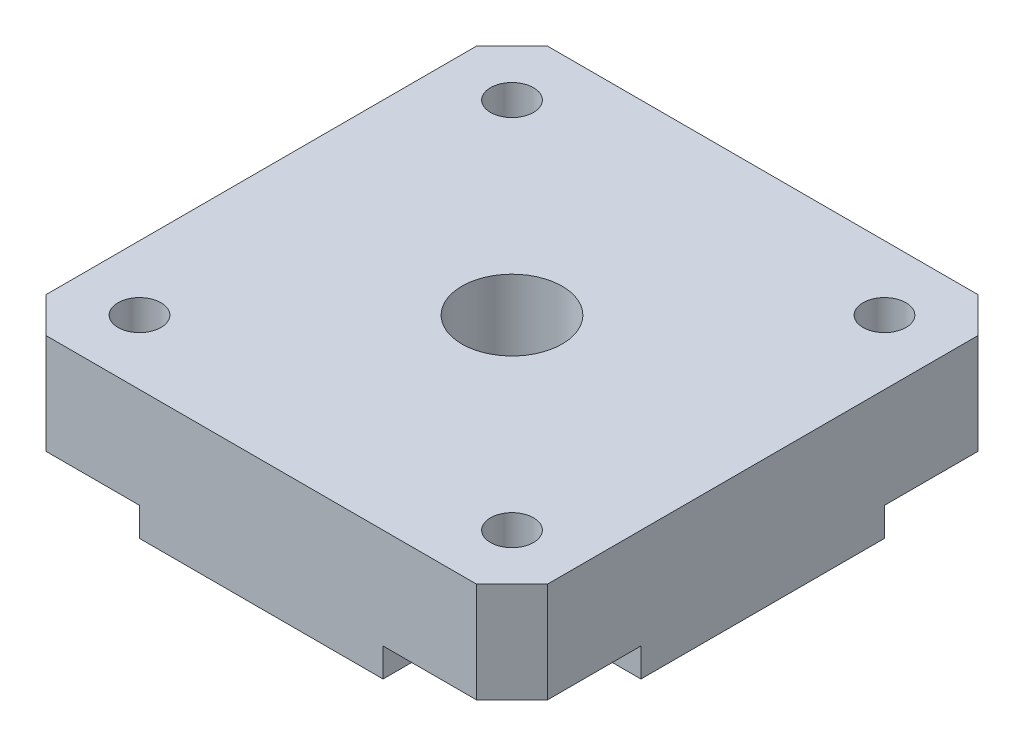
ISO-10303-21;
HEADER;
FILE_DESCRIPTION(('STEP AP214'),'2;1');
FILE_NAME('part.step','',(''),(''),'','','');
FILE_SCHEMA(('AUTOMOTIVE_DESIGN { 1 0 10303 214 1 1 1 1 }'));
ENDSEC;
DATA;
#1=APPLICATION_CONTEXT('core data for automotive mechanical design processes');
#2=APPLICATION_PROTOCOL_DEFINITION('international standard','automotive_design',2000,#1);
#3=PRODUCT_CONTEXT('',#1,'mechanical');
#4=PRODUCT('Part','Part','',(#3));
#5=PRODUCT_RELATED_PRODUCT_CATEGORY('part','',(#4));
#6=PRODUCT_DEFINITION_FORMATION('','',#4);
#7=PRODUCT_DEFINITION_CONTEXT('part definition',#1,'design');
#8=PRODUCT_DEFINITION('design','',#6,#7);
#9=PRODUCT_DEFINITION_SHAPE('','',#8);
#10=(LENGTH_UNIT() NAMED_UNIT(*) SI_UNIT(.MILLI.,.METRE.));
#11=(NAMED_UNIT(*) PLANE_ANGLE_UNIT() SI_UNIT($,.RADIAN.));
#12=(NAMED_UNIT(*) SI_UNIT($,.STERADIAN.) SOLID_ANGLE_UNIT());
#13=UNCERTAINTY_MEASURE_WITH_UNIT(LENGTH_MEASURE(1.E-05),#10,'distance_accuracy_value','');
#14=(GEOMETRIC_REPRESENTATION_CONTEXT(3) GLOBAL_UNCERTAINTY_ASSIGNED_CONTEXT((#13)) GLOBAL_UNIT_ASSIGNED_CONTEXT((#10,
#11,#12)) REPRESENTATION_CONTEXT('',''));
#15=CARTESIAN_POINT('',(0.,0.,0.));
#16=DIRECTION('',(0.,0.,1.));
#17=DIRECTION('',(1.,0.,0.));
#18=AXIS2_PLACEMENT_3D('',#15,#16,#17);
#19=CARTESIAN_POINT('',(32.5269119345812,9.,0.));
#20=DIRECTION('',(-0.707106781186545,0.,-0.70710678118655));
#21=DIRECTION('',(-0.70710678118655,0.,0.707106781186545));
#22=AXIS2_PLACEMENT_3D('',#19,#20,#21);
#23=PLANE('',#22);
#24=DIRECTION('',(-0.70710678118655,0.,0.707106781186545));
#25=VECTOR('',#24,1.);
#26=CARTESIAN_POINT('',(32.5269119345812,2.,0.));
#27=LINE('',#26,#25);
#28=CARTESIAN_POINT('',(34.9999999999998,2.,-2.47308806541876));
#29=VERTEX_POINT('',#28);
#30=CARTESIAN_POINT('',(32.526911934581,2.,1.9832495002273E-13));
#31=VERTEX_POINT('',#30);
#32=EDGE_CURVE('E206',#29,#31,#27,.T.);
#33=ORIENTED_EDGE('',*,*,#32,.F.);
#34=DIRECTION('',(0.,-1.,0.));
#35=VECTOR('',#34,1.);
#36=CARTESIAN_POINT('',(35.,9.,-2.47308806541876));
#37=LINE('',#36,#35);
#38=CARTESIAN_POINT('',(35.,9.,-2.47308806541876));
#39=VERTEX_POINT('',#38);
#40=EDGE_CURVE('E388',#39,#29,#37,.T.);
#41=ORIENTED_EDGE('',*,*,#40,.F.);
#42=DIRECTION('',(0.70710678118655,0.,-0.707106781186545));
#43=VECTOR('',#42,1.);
#44=CARTESIAN_POINT('',(32.5269119345812,9.,0.));
#45=LINE('',#44,#43);
#46=CARTESIAN_POINT('',(32.5269119345812,9.,0.));
#47=VERTEX_POINT('',#46);
#48=EDGE_CURVE('E359',#47,#39,#45,.T.);
#49=ORIENTED_EDGE('',*,*,#48,.F.);
#50=DIRECTION('',(0.,-1.,0.));
#51=VECTOR('',#50,1.);
#52=CARTESIAN_POINT('',(32.5269119345812,9.,0.));
#53=LINE('',#52,#51);
#54=EDGE_CURVE('E391',#47,#31,#53,.T.);
#55=ORIENTED_EDGE('',*,*,#54,.T.);
#56=EDGE_LOOP('',(#33,#41,#49,#55));
#57=FACE_BOUND('',#56,.T.);
#58=ADVANCED_FACE('F33',(#57),#23,.F.);
#59=CARTESIAN_POINT('',(35.,9.,-32.5269119345811));
#60=DIRECTION('',(-0.707106781186548,0.,0.707106781186547));
#61=DIRECTION('',(0.707106781186547,0.,0.707106781186548));
#62=AXIS2_PLACEMENT_3D('',#59,#60,#61);
#63=PLANE('',#62);
#64=DIRECTION('',(0.707106781186547,0.,0.707106781186548));
#65=VECTOR('',#64,1.);
#66=CARTESIAN_POINT('',(35.,2.,-32.5269119345811));
#67=LINE('',#66,#65);
#68=CARTESIAN_POINT('',(32.5269119345812,2.,-34.9999999999996));
#69=VERTEX_POINT('',#68);
#70=CARTESIAN_POINT('',(34.9999999999999,2.,-32.5269119345813));
#71=VERTEX_POINT('',#70);
#72=EDGE_CURVE('E295',#69,#71,#67,.T.);
#73=ORIENTED_EDGE('',*,*,#72,.F.);
#74=DIRECTION('',(0.,-1.,0.));
#75=VECTOR('',#74,1.);
#76=CARTESIAN_POINT('',(32.5269119345812,9.,-34.9999999999999));
#77=LINE('',#76,#75);
#78=CARTESIAN_POINT('',(32.5269119345812,9.,-34.9999999999999));
#79=VERTEX_POINT('',#78);
#80=EDGE_CURVE('E382',#79,#69,#77,.T.);
#81=ORIENTED_EDGE('',*,*,#80,.F.);
#82=DIRECTION('',(-0.707106781186547,0.,-0.707106781186549));
#83=VECTOR('',#82,1.);
#84=CARTESIAN_POINT('',(35.,9.,-32.5269119345811));
#85=LINE('',#84,#83);
#86=CARTESIAN_POINT('',(35.,9.,-32.5269119345811));
#87=VERTEX_POINT('',#86);
#88=EDGE_CURVE('E363',#87,#79,#85,.T.);
#89=ORIENTED_EDGE('',*,*,#88,.F.);
#90=DIRECTION('',(0.,-1.,0.));
#91=VECTOR('',#90,1.);
#92=CARTESIAN_POINT('',(35.,9.,-32.5269119345811));
#93=LINE('',#92,#91);
#94=EDGE_CURVE('E385',#87,#71,#93,.T.);
#95=ORIENTED_EDGE('',*,*,#94,.T.);
#96=EDGE_LOOP('',(#73,#81,#89,#95));
#97=FACE_BOUND('',#96,.T.);
#98=ADVANCED_FACE('F422',(#97),#63,.F.);
#99=CARTESIAN_POINT('',(2.47308806541877,9.,-34.9999999999999));
#100=DIRECTION('',(0.707106781186547,0.,0.707106781186548));
#101=DIRECTION('',(0.707106781186548,0.,-0.707106781186547));
#102=AXIS2_PLACEMENT_3D('',#99,#100,#101);
#103=PLANE('',#102);
#104=DIRECTION('',(0.707106781186548,0.,-0.707106781186547));
#105=VECTOR('',#104,1.);
#106=CARTESIAN_POINT('',(2.47308806541877,2.,-34.9999999999999));
#107=LINE('',#106,#105);
#108=CARTESIAN_POINT('',(0.,2.,-32.5269119345812));
#109=VERTEX_POINT('',#108);
#110=CARTESIAN_POINT('',(2.47308806541844,2.,-34.9999999999996));
#111=VERTEX_POINT('',#110);
#112=EDGE_CURVE('E297',#109,#111,#107,.T.);
#113=ORIENTED_EDGE('',*,*,#112,.F.);
#114=DIRECTION('',(0.,-1.,0.));
#115=VECTOR('',#114,1.);
#116=CARTESIAN_POINT('',(0.,9.,-32.5269119345811));
#117=LINE('',#116,#115);
#118=CARTESIAN_POINT('',(0.,9.,-32.5269119345811));
#119=VERTEX_POINT('',#118);
#120=EDGE_CURVE('E369',#119,#109,#117,.T.);
#121=ORIENTED_EDGE('',*,*,#120,.F.);
#122=DIRECTION('',(-0.707106781186549,0.,0.707106781186547));
#123=VECTOR('',#122,1.);
#124=CARTESIAN_POINT('',(2.47308806541877,9.,-34.9999999999999));
#125=LINE('',#124,#123);
#126=CARTESIAN_POINT('',(2.47308806541877,9.,-34.9999999999999));
#127=VERTEX_POINT('',#126);
#128=EDGE_CURVE('E367',#127,#119,#125,.T.);
#129=ORIENTED_EDGE('',*,*,#128,.F.);
#130=DIRECTION('',(0.,-1.,0.));
#131=VECTOR('',#130,1.);
#132=CARTESIAN_POINT('',(2.47308806541877,9.,-34.9999999999999));
#133=LINE('',#132,#131);
#134=EDGE_CURVE('E379',#127,#111,#133,.T.);
#135=ORIENTED_EDGE('',*,*,#134,.T.);
#136=EDGE_LOOP('',(#113,#121,#129,#135));
#137=FACE_BOUND('',#136,.T.);
#138=ADVANCED_FACE('F418',(#137),#103,.F.);
#139=CARTESIAN_POINT('',(4.5,0.,-30.4999999999999));
#140=DIRECTION('',(0.,1.,0.));
#141=DIRECTION('',(0.,0.,1.));
#142=AXIS2_PLACEMENT_3D('',#139,#140,#141);
#143=CYLINDRICAL_SURFACE('',#142,1.5);
#144=CARTESIAN_POINT('',(4.5,9.,-30.4999999999999));
#145=DIRECTION('',(0.,1.,0.));
#146=DIRECTION('',(0.,0.,1.));
#147=AXIS2_PLACEMENT_3D('',#144,#145,#146);
#148=CIRCLE('',#147,1.5);
#149=CARTESIAN_POINT('',(4.5,9.,-28.9999999999999));
#150=VERTEX_POINT('',#149);
#151=EDGE_CURVE('E341',#150,#150,#148,.T.);
#152=ORIENTED_EDGE('',*,*,#151,.T.);
#153=EDGE_LOOP('',(#152));
#154=FACE_BOUND('',#153,.T.);
#155=CARTESIAN_POINT('',(4.5,2.,-30.4999999999999));
#156=DIRECTION('',(0.,-1.,0.));
#157=DIRECTION('',(0.,0.,-1.));
#158=AXIS2_PLACEMENT_3D('',#155,#156,#157);
#159=CIRCLE('',#158,1.5);
#160=CARTESIAN_POINT('',(4.5,2.,-31.9999999999999));
#161=VERTEX_POINT('',#160);
#162=EDGE_CURVE('E37',#161,#161,#159,.F.);
#163=ORIENTED_EDGE('',*,*,#162,.F.);
#164=EDGE_LOOP('',(#163));
#165=FACE_BOUND('',#164,.T.);
#166=ADVANCED_FACE('F408',(#154,#165),#143,.F.);
#167=CARTESIAN_POINT('',(30.5,0.,-30.5000000000006));
#168=DIRECTION('',(0.,1.,0.));
#169=DIRECTION('',(0.,0.,1.));
#170=AXIS2_PLACEMENT_3D('',#167,#168,#169);
#171=CYLINDRICAL_SURFACE('',#170,1.5);
#172=CARTESIAN_POINT('',(30.5,9.,-30.5000000000006));
#173=DIRECTION('',(0.,1.,0.));
#174=DIRECTION('',(0.,0.,1.));
#175=AXIS2_PLACEMENT_3D('',#172,#173,#174);
#176=CIRCLE('',#175,1.5);
#177=CARTESIAN_POINT('',(30.5,9.,-29.0000000000006));
#178=VERTEX_POINT('',#177);
#179=EDGE_CURVE('E338',#178,#178,#176,.T.);
#180=ORIENTED_EDGE('',*,*,#179,.T.);
#181=EDGE_LOOP('',(#180));
#182=FACE_BOUND('',#181,.T.);
#183=CARTESIAN_POINT('',(30.5,2.,-30.5000000000006));
#184=DIRECTION('',(0.,-1.,0.));
#185=DIRECTION('',(0.,0.,-1.));
#186=AXIS2_PLACEMENT_3D('',#183,#184,#185);
#187=CIRCLE('',#186,1.5);
#188=CARTESIAN_POINT('',(30.5,2.,-32.0000000000006));
#189=VERTEX_POINT('',#188);
#190=EDGE_CURVE('E293',#189,#189,#187,.F.);
#191=ORIENTED_EDGE('',*,*,#190,.F.);
#192=EDGE_LOOP('',(#191));
#193=FACE_BOUND('',#192,.T.);
#194=ADVANCED_FACE('F405',(#182,#193),#171,.F.);
#195=CARTESIAN_POINT('',(30.5000000000006,0.,-4.50000000000058));
#196=DIRECTION('',(0.,1.,0.));
#197=DIRECTION('',(0.,0.,1.));
#198=AXIS2_PLACEMENT_3D('',#195,#196,#197);
#199=CYLINDRICAL_SURFACE('',#198,1.5);
#200=CARTESIAN_POINT('',(30.5000000000006,9.,-4.50000000000058));
#201=DIRECTION('',(0.,1.,0.));
#202=DIRECTION('',(0.,0.,1.));
#203=AXIS2_PLACEMENT_3D('',#200,#201,#202);
#204=CIRCLE('',#203,1.5);
#205=CARTESIAN_POINT('',(30.5000000000006,9.,-3.00000000000058));
#206=VERTEX_POINT('',#205);
#207=EDGE_CURVE('E335',#206,#206,#204,.T.);
#208=ORIENTED_EDGE('',*,*,#207,.T.);
#209=EDGE_LOOP('',(#208));
#210=FACE_BOUND('',#209,.T.);
#211=CARTESIAN_POINT('',(30.5000000000006,2.,-4.50000000000058));
#212=DIRECTION('',(0.,-1.,0.));
#213=DIRECTION('',(0.,0.,-1.));
#214=AXIS2_PLACEMENT_3D('',#211,#212,#213);
#215=CIRCLE('',#214,1.5);
#216=CARTESIAN_POINT('',(30.5000000000006,2.,-6.00000000000058));
#217=VERTEX_POINT('',#216);
#218=EDGE_CURVE('E294',#217,#217,#215,.F.);
#219=ORIENTED_EDGE('',*,*,#218,.F.);
#220=EDGE_LOOP('',(#219));
#221=FACE_BOUND('',#220,.T.);
#222=ADVANCED_FACE('F407',(#210,#221),#199,.F.);
#223=CARTESIAN_POINT('',(0.,9.,-2.47308806541876));
#224=DIRECTION('',(0.707106781186549,0.,-0.707106781186546));
#225=DIRECTION('',(-0.707106781186546,0.,-0.707106781186549));
#226=AXIS2_PLACEMENT_3D('',#223,#224,#225);
#227=PLANE('',#226);
#228=DIRECTION('',(-0.707106781186546,0.,-0.707106781186549));
#229=VECTOR('',#228,1.);
#230=CARTESIAN_POINT('',(0.,2.,-2.47308806541876));
#231=LINE('',#230,#229);
#232=CARTESIAN_POINT('',(2.47308806541877,2.,0.));
#233=VERTEX_POINT('',#232);
#234=CARTESIAN_POINT('',(0.,2.,-2.47308806541877));
#235=VERTEX_POINT('',#234);
#236=EDGE_CURVE('E330',#233,#235,#231,.T.);
#237=ORIENTED_EDGE('',*,*,#236,.F.);
#238=DIRECTION('',(0.,-1.,0.));
#239=VECTOR('',#238,1.);
#240=CARTESIAN_POINT('',(2.47308806541877,9.,0.));
#241=LINE('',#240,#239);
#242=CARTESIAN_POINT('',(2.47308806541877,9.,0.));
#243=VERTEX_POINT('',#242);
#244=EDGE_CURVE('E42',#243,#233,#241,.T.);
#245=ORIENTED_EDGE('',*,*,#244,.F.);
#246=DIRECTION('',(0.707106781186546,0.,0.707106781186548));
#247=VECTOR('',#246,1.);
#248=CARTESIAN_POINT('',(0.,9.,-2.47308806541876));
#249=LINE('',#248,#247);
#250=CARTESIAN_POINT('',(0.,9.,-2.47308806541876));
#251=VERTEX_POINT('',#250);
#252=EDGE_CURVE('E354',#251,#243,#249,.T.);
#253=ORIENTED_EDGE('',*,*,#252,.F.);
#254=DIRECTION('',(0.,-1.,0.));
#255=VECTOR('',#254,1.);
#256=CARTESIAN_POINT('',(0.,9.,-2.47308806541876));
#257=LINE('',#256,#255);
#258=EDGE_CURVE('E11',#251,#235,#257,.T.);
#259=ORIENTED_EDGE('',*,*,#258,.T.);
#260=EDGE_LOOP('',(#237,#245,#253,#259));
#261=FACE_BOUND('',#260,.T.);
#262=ADVANCED_FACE('F415',(#261),#227,.F.);
#263=CARTESIAN_POINT('',(4.5000000000006,0.,-4.50000000000008));
#264=DIRECTION('',(0.,1.,0.));
#265=DIRECTION('',(0.,0.,1.));
#266=AXIS2_PLACEMENT_3D('',#263,#264,#265);
#267=CYLINDRICAL_SURFACE('',#266,1.5);
#268=CARTESIAN_POINT('',(4.5000000000006,9.,-4.50000000000008));
#269=DIRECTION('',(0.,1.,0.));
#270=DIRECTION('',(0.,0.,1.));
#271=AXIS2_PLACEMENT_3D('',#268,#269,#270);
#272=CIRCLE('',#271,1.5);
#273=CARTESIAN_POINT('',(4.5000000000006,9.,-3.00000000000007));
#274=VERTEX_POINT('',#273);
#275=EDGE_CURVE('E332',#274,#274,#272,.T.);
#276=ORIENTED_EDGE('',*,*,#275,.T.);
#277=EDGE_LOOP('',(#276));
#278=FACE_BOUND('',#277,.T.);
#279=CARTESIAN_POINT('',(4.5000000000006,2.,-4.50000000000008));
#280=DIRECTION('',(0.,-1.,0.));
#281=DIRECTION('',(0.,0.,-1.));
#282=AXIS2_PLACEMENT_3D('',#279,#280,#281);
#283=CIRCLE('',#282,1.5);
#284=CARTESIAN_POINT('',(4.5000000000006,2.,-6.00000000000008));
#285=VERTEX_POINT('',#284);
#286=EDGE_CURVE('E323',#285,#285,#283,.F.);
#287=ORIENTED_EDGE('',*,*,#286,.F.);
#288=EDGE_LOOP('',(#287));
#289=FACE_BOUND('',#288,.T.);
#290=ADVANCED_FACE('F435',(#278,#289),#267,.F.);
#291=CARTESIAN_POINT('',(0.,9.,-32.5269119345811));
#292=DIRECTION('',(1.,0.,0.));
#293=DIRECTION('',(0.,0.,-1.));
#294=AXIS2_PLACEMENT_3D('',#291,#292,#293);
#295=PLANE('',#294);
#296=DIRECTION('',(0.,0.,-1.));
#297=VECTOR('',#296,1.);
#298=CARTESIAN_POINT('',(0.,2.,-34.9999999999995));
#299=LINE('',#298,#297);
#300=CARTESIAN_POINT('',(1.63658935187837E-13,2.,-25.9999999999995));
#301=VERTEX_POINT('',#300);
#302=EDGE_CURVE('E277',#301,#109,#299,.T.);
#303=ORIENTED_EDGE('',*,*,#302,.F.);
#304=DIRECTION('',(0.,-1.,0.));
#305=VECTOR('',#304,1.);
#306=CARTESIAN_POINT('',(1.63658935187837E-13,2.,-25.9999999999995));
#307=LINE('',#306,#305);
#308=CARTESIAN_POINT('',(1.63658935187837E-13,0.,-25.9999999999995));
#309=VERTEX_POINT('',#308);
#310=EDGE_CURVE('E252',#301,#309,#307,.T.);
#311=ORIENTED_EDGE('',*,*,#310,.T.);
#312=DIRECTION('',(0.,0.,1.));
#313=VECTOR('',#312,1.);
#314=CARTESIAN_POINT('',(0.,0.,-32.5269119345811));
#315=LINE('',#314,#313);
#316=CARTESIAN_POINT('',(0.,0.,-9.));
#317=VERTEX_POINT('',#316);
#318=EDGE_CURVE('E348',#309,#317,#315,.T.);
#319=ORIENTED_EDGE('',*,*,#318,.T.);
#320=DIRECTION('',(0.,-1.,0.));
#321=VECTOR('',#320,1.);
#322=CARTESIAN_POINT('',(0.,2.,-9.));
#323=LINE('',#322,#321);
#324=CARTESIAN_POINT('',(0.,2.,-9.));
#325=VERTEX_POINT('',#324);
#326=EDGE_CURVE('E314',#325,#317,#323,.T.);
#327=ORIENTED_EDGE('',*,*,#326,.F.);
#328=DIRECTION('',(0.,0.,-1.));
#329=VECTOR('',#328,1.);
#330=CARTESIAN_POINT('',(0.,2.,0.));
#331=LINE('',#330,#329);
#332=EDGE_CURVE('E300',#235,#325,#331,.T.);
#333=ORIENTED_EDGE('',*,*,#332,.F.);
#334=ORIENTED_EDGE('',*,*,#258,.F.);
#335=DIRECTION('',(0.,0.,1.));
#336=VECTOR('',#335,1.);
#337=CARTESIAN_POINT('',(0.,9.,-32.5269119345811));
#338=LINE('',#337,#336);
#339=EDGE_CURVE('E351',#119,#251,#338,.T.);
#340=ORIENTED_EDGE('',*,*,#339,.F.);
#341=ORIENTED_EDGE('',*,*,#120,.T.);
#342=EDGE_LOOP('',(#303,#311,#319,#327,#333,#334,#340,#341));
#343=FACE_BOUND('',#342,.T.);
#344=ADVANCED_FACE('F35',(#343),#295,.F.);
#345=CARTESIAN_POINT('',(2.47308806541877,9.,0.));
#346=DIRECTION('',(0.,0.,-1.));
#347=DIRECTION('',(-1.,0.,0.));
#348=AXIS2_PLACEMENT_3D('',#345,#346,#347);
#349=PLANE('',#348);
#350=DIRECTION('',(1.,0.,0.));
#351=VECTOR('',#350,1.);
#352=CARTESIAN_POINT('',(2.47308806541877,0.,0.));
#353=LINE('',#352,#351);
#354=CARTESIAN_POINT('',(9.,0.,0.));
#355=VERTEX_POINT('',#354);
#356=CARTESIAN_POINT('',(25.9999999999998,0.,0.));
#357=VERTEX_POINT('',#356);
#358=EDGE_CURVE('E226',#355,#357,#353,.T.);
#359=ORIENTED_EDGE('',*,*,#358,.T.);
#360=DIRECTION('',(0.,-1.,0.));
#361=VECTOR('',#360,1.);
#362=CARTESIAN_POINT('',(25.9999999999998,2.,2.19640829193072E-13));
#363=LINE('',#362,#361);
#364=CARTESIAN_POINT('',(25.9999999999998,2.,2.19640829193072E-13));
#365=VERTEX_POINT('',#364);
#366=EDGE_CURVE('E216',#365,#357,#363,.T.);
#367=ORIENTED_EDGE('',*,*,#366,.F.);
#368=DIRECTION('',(-1.,0.,0.));
#369=VECTOR('',#368,1.);
#370=CARTESIAN_POINT('',(34.9999999999998,2.,1.90819582357449E-13));
#371=LINE('',#370,#369);
#372=EDGE_CURVE('E200',#31,#365,#371,.T.);
#373=ORIENTED_EDGE('',*,*,#372,.F.);
#374=ORIENTED_EDGE('',*,*,#54,.F.);
#375=DIRECTION('',(1.,0.,0.));
#376=VECTOR('',#375,1.);
#377=CARTESIAN_POINT('',(2.47308806541877,9.,0.));
#378=LINE('',#377,#376);
#379=EDGE_CURVE('E357',#243,#47,#378,.T.);
#380=ORIENTED_EDGE('',*,*,#379,.F.);
#381=ORIENTED_EDGE('',*,*,#244,.T.);
#382=DIRECTION('',(-1.,0.,0.));
#383=VECTOR('',#382,1.);
#384=CARTESIAN_POINT('',(0.,2.,0.));
#385=LINE('',#384,#383);
#386=CARTESIAN_POINT('',(9.,2.,0.));
#387=VERTEX_POINT('',#386);
#388=EDGE_CURVE('E312',#387,#233,#385,.T.);
#389=ORIENTED_EDGE('',*,*,#388,.F.);
#390=DIRECTION('',(0.,-1.,0.));
#391=VECTOR('',#390,1.);
#392=CARTESIAN_POINT('',(9.,2.,0.));
#393=LINE('',#392,#391);
#394=EDGE_CURVE('E321',#387,#355,#393,.T.);
#395=ORIENTED_EDGE('',*,*,#394,.T.);
#396=EDGE_LOOP('',(#359,#367,#373,#374,#380,#381,#389,#395));
#397=FACE_BOUND('',#396,.T.);
#398=ADVANCED_FACE('F223',(#397),#349,.F.);
#399=CARTESIAN_POINT('',(35.,9.,-2.47308806541876));
#400=DIRECTION('',(-1.,0.,0.));
#401=DIRECTION('',(0.,0.,1.));
#402=AXIS2_PLACEMENT_3D('',#399,#400,#401);
#403=PLANE('',#402);
#404=DIRECTION('',(0.,0.,1.));
#405=VECTOR('',#404,1.);
#406=CARTESIAN_POINT('',(34.9999999999998,2.,1.90819582357449E-13));
#407=LINE('',#406,#405);
#408=CARTESIAN_POINT('',(34.9999999999997,2.,-8.99999999999981));
#409=VERTEX_POINT('',#408);
#410=EDGE_CURVE('E227',#409,#29,#407,.T.);
#411=ORIENTED_EDGE('',*,*,#410,.F.);
#412=DIRECTION('',(0.,-1.,0.));
#413=VECTOR('',#412,1.);
#414=CARTESIAN_POINT('',(34.9999999999997,2.,-8.99999999999981));
#415=LINE('',#414,#413);
#416=CARTESIAN_POINT('',(34.9999999999997,0.,-8.99999999999981));
#417=VERTEX_POINT('',#416);
#418=EDGE_CURVE('E398',#409,#417,#415,.T.);
#419=ORIENTED_EDGE('',*,*,#418,.T.);
#420=DIRECTION('',(0.,0.,-1.));
#421=VECTOR('',#420,1.);
#422=CARTESIAN_POINT('',(35.,0.,-2.47308806541876));
#423=LINE('',#422,#421);
#424=CARTESIAN_POINT('',(35.,0.,-25.9999999999996));
#425=VERTEX_POINT('',#424);
#426=EDGE_CURVE('E372',#417,#425,#423,.T.);
#427=ORIENTED_EDGE('',*,*,#426,.T.);
#428=DIRECTION('',(0.,-1.,0.));
#429=VECTOR('',#428,1.);
#430=CARTESIAN_POINT('',(34.9999999999999,2.,-25.9999999999996));
#431=LINE('',#430,#429);
#432=CARTESIAN_POINT('',(34.9999999999999,2.,-25.9999999999996));
#433=VERTEX_POINT('',#432);
#434=EDGE_CURVE('E50',#433,#425,#431,.T.);
#435=ORIENTED_EDGE('',*,*,#434,.F.);
#436=DIRECTION('',(0.,0.,1.));
#437=VECTOR('',#436,1.);
#438=CARTESIAN_POINT('',(34.9999999999999,2.,-34.9999999999996));
#439=LINE('',#438,#437);
#440=EDGE_CURVE('E235',#71,#433,#439,.T.);
#441=ORIENTED_EDGE('',*,*,#440,.F.);
#442=ORIENTED_EDGE('',*,*,#94,.F.);
#443=DIRECTION('',(0.,0.,-1.));
#444=VECTOR('',#443,1.);
#445=CARTESIAN_POINT('',(35.,9.,-2.47308806541876));
#446=LINE('',#445,#444);
#447=EDGE_CURVE('E361',#39,#87,#446,.T.);
#448=ORIENTED_EDGE('',*,*,#447,.F.);
#449=ORIENTED_EDGE('',*,*,#40,.T.);
#450=EDGE_LOOP('',(#411,#419,#427,#435,#441,#442,#448,#449));
#451=FACE_BOUND('',#450,.T.);
#452=ADVANCED_FACE('F432',(#451),#403,.F.);
#453=CARTESIAN_POINT('',(32.5269119345812,9.,-34.9999999999999));
#454=DIRECTION('',(0.,0.,1.));
#455=DIRECTION('',(1.,0.,0.));
#456=AXIS2_PLACEMENT_3D('',#453,#454,#455);
#457=PLANE('',#456);
#458=DIRECTION('',(1.,0.,0.));
#459=VECTOR('',#458,1.);
#460=CARTESIAN_POINT('',(34.9999999999999,2.,-34.9999999999996));
#461=LINE('',#460,#459);
#462=CARTESIAN_POINT('',(25.9999999999999,2.,-34.9999999999995));
#463=VERTEX_POINT('',#462);
#464=EDGE_CURVE('E247',#463,#69,#461,.T.);
#465=ORIENTED_EDGE('',*,*,#464,.F.);
#466=DIRECTION('',(0.,-1.,0.));
#467=VECTOR('',#466,1.);
#468=CARTESIAN_POINT('',(25.9999999999999,2.,-34.9999999999995));
#469=LINE('',#468,#467);
#470=CARTESIAN_POINT('',(25.9999999999999,0.,-34.9999999999995));
#471=VERTEX_POINT('',#470);
#472=EDGE_CURVE('E256',#463,#471,#469,.T.);
#473=ORIENTED_EDGE('',*,*,#472,.T.);
#474=DIRECTION('',(-1.,0.,0.));
#475=VECTOR('',#474,1.);
#476=CARTESIAN_POINT('',(32.5269119345812,0.,-34.9999999999999));
#477=LINE('',#476,#475);
#478=CARTESIAN_POINT('',(9.00000000000009,0.,-34.9999999999999));
#479=VERTEX_POINT('',#478);
#480=EDGE_CURVE('E355',#471,#479,#477,.T.);
#481=ORIENTED_EDGE('',*,*,#480,.T.);
#482=DIRECTION('',(0.,-1.,0.));
#483=VECTOR('',#482,1.);
#484=CARTESIAN_POINT('',(9.00000000000007,2.,-34.9999999999996));
#485=LINE('',#484,#483);
#486=CARTESIAN_POINT('',(9.00000000000007,2.,-34.9999999999996));
#487=VERTEX_POINT('',#486);
#488=EDGE_CURVE('E58',#487,#479,#485,.T.);
#489=ORIENTED_EDGE('',*,*,#488,.F.);
#490=DIRECTION('',(1.,0.,0.));
#491=VECTOR('',#490,1.);
#492=CARTESIAN_POINT('',(0.,2.,-34.9999999999995));
#493=LINE('',#492,#491);
#494=EDGE_CURVE('E265',#111,#487,#493,.T.);
#495=ORIENTED_EDGE('',*,*,#494,.F.);
#496=ORIENTED_EDGE('',*,*,#134,.F.);
#497=DIRECTION('',(-1.,0.,0.));
#498=VECTOR('',#497,1.);
#499=CARTESIAN_POINT('',(32.5269119345812,9.,-34.9999999999999));
#500=LINE('',#499,#498);
#501=EDGE_CURVE('E365',#79,#127,#500,.T.);
#502=ORIENTED_EDGE('',*,*,#501,.F.);
#503=ORIENTED_EDGE('',*,*,#80,.T.);
#504=EDGE_LOOP('',(#465,#473,#481,#489,#495,#496,#502,#503));
#505=FACE_BOUND('',#504,.T.);
#506=ADVANCED_FACE('F505',(#505),#457,.F.);
#507=CARTESIAN_POINT('',(0.,9.,0.));
#508=DIRECTION('',(0.,1.,0.));
#509=DIRECTION('',(0.,0.,1.));
#510=AXIS2_PLACEMENT_3D('',#507,#508,#509);
#511=PLANE('',#510);
#512=ORIENTED_EDGE('',*,*,#275,.F.);
#513=EDGE_LOOP('',(#512));
#514=FACE_BOUND('',#513,.T.);
#515=ORIENTED_EDGE('',*,*,#207,.F.);
#516=EDGE_LOOP('',(#515));
#517=FACE_BOUND('',#516,.T.);
#518=ORIENTED_EDGE('',*,*,#179,.F.);
#519=EDGE_LOOP('',(#518));
#520=FACE_BOUND('',#519,.T.);
#521=ORIENTED_EDGE('',*,*,#151,.F.);
#522=EDGE_LOOP('',(#521));
#523=FACE_BOUND('',#522,.T.);
#524=CARTESIAN_POINT('',(17.5,9.,-17.4999999999999));
#525=DIRECTION('',(0.,1.,0.));
#526=DIRECTION('',(0.,0.,1.));
#527=AXIS2_PLACEMENT_3D('',#524,#525,#526);
#528=CIRCLE('',#527,3.5);
#529=CARTESIAN_POINT('',(17.5,9.,-13.9999999999999));
#530=VERTEX_POINT('',#529);
#531=EDGE_CURVE('E344',#530,#530,#528,.T.);
#532=ORIENTED_EDGE('',*,*,#531,.F.);
#533=EDGE_LOOP('',(#532));
#534=FACE_BOUND('',#533,.T.);
#535=ORIENTED_EDGE('',*,*,#339,.T.);
#536=ORIENTED_EDGE('',*,*,#252,.T.);
#537=ORIENTED_EDGE('',*,*,#379,.T.);
#538=ORIENTED_EDGE('',*,*,#48,.T.);
#539=ORIENTED_EDGE('',*,*,#447,.T.);
#540=ORIENTED_EDGE('',*,*,#88,.T.);
#541=ORIENTED_EDGE('',*,*,#501,.T.);
#542=ORIENTED_EDGE('',*,*,#128,.T.);
#543=EDGE_LOOP('',(#535,#536,#537,#538,#539,#540,#541,#542));
#544=FACE_BOUND('',#543,.T.);
#545=ADVANCED_FACE('F451',(#514,#517,#520,#523,#534,#544),#511,.T.);
#546=CARTESIAN_POINT('',(0.,0.,0.));
#547=DIRECTION('',(0.,1.,0.));
#548=DIRECTION('',(0.,0.,1.));
#549=AXIS2_PLACEMENT_3D('',#546,#547,#548);
#550=PLANE('',#549);
#551=CARTESIAN_POINT('',(17.5,0.,-17.4999999999999));
#552=DIRECTION('',(0.,1.,0.));
#553=DIRECTION('',(0.,0.,1.));
#554=AXIS2_PLACEMENT_3D('',#551,#552,#553);
#555=CIRCLE('',#554,3.5);
#556=CARTESIAN_POINT('',(17.5,0.,-13.9999999999999));
#557=VERTEX_POINT('',#556);
#558=EDGE_CURVE('E345',#557,#557,#555,.T.);
#559=ORIENTED_EDGE('',*,*,#558,.T.);
#560=EDGE_LOOP('',(#559));
#561=FACE_BOUND('',#560,.T.);
#562=ORIENTED_EDGE('',*,*,#426,.F.);
#563=DIRECTION('',(1.,0.,0.));
#564=VECTOR('',#563,1.);
#565=CARTESIAN_POINT('',(34.9999999999997,0.,-8.99999999999981));
#566=LINE('',#565,#564);
#567=CARTESIAN_POINT('',(29.9999999999998,0.,-8.99999999999979));
#568=VERTEX_POINT('',#567);
#569=EDGE_CURVE('E211',#568,#417,#566,.T.);
#570=ORIENTED_EDGE('',*,*,#569,.F.);
#571=CARTESIAN_POINT('',(29.9999999999998,0.,-4.99999999999979));
#572=DIRECTION('',(0.,-1.,0.));
#573=DIRECTION('',(0.,0.,-1.));
#574=AXIS2_PLACEMENT_3D('',#571,#572,#573);
#575=CIRCLE('',#574,4.);
#576=CARTESIAN_POINT('',(25.9999999999998,0.,-4.99999999999975));
#577=VERTEX_POINT('',#576);
#578=EDGE_CURVE('E478',#577,#568,#575,.T.);
#579=ORIENTED_EDGE('',*,*,#578,.F.);
#580=DIRECTION('',(0.,0.,-1.));
#581=VECTOR('',#580,1.);
#582=CARTESIAN_POINT('',(25.9999999999998,0.,2.19640829193072E-13));
#583=LINE('',#582,#581);
#584=EDGE_CURVE('E259',#357,#577,#583,.T.);
#585=ORIENTED_EDGE('',*,*,#584,.F.);
#586=ORIENTED_EDGE('',*,*,#358,.F.);
#587=DIRECTION('',(0.,0.,1.));
#588=VECTOR('',#587,1.);
#589=CARTESIAN_POINT('',(9.,0.,0.));
#590=LINE('',#589,#588);
#591=CARTESIAN_POINT('',(9.,0.,-4.99999999999997));
#592=VERTEX_POINT('',#591);
#593=EDGE_CURVE('E303',#592,#355,#590,.T.);
#594=ORIENTED_EDGE('',*,*,#593,.F.);
#595=CARTESIAN_POINT('',(5.,0.,-5.));
#596=DIRECTION('',(0.,-1.,0.));
#597=DIRECTION('',(0.,0.,-1.));
#598=AXIS2_PLACEMENT_3D('',#595,#596,#597);
#599=CIRCLE('',#598,4.);
#600=CARTESIAN_POINT('',(4.99999999999997,0.,-9.));
#601=VERTEX_POINT('',#600);
#602=EDGE_CURVE('E317',#601,#592,#599,.T.);
#603=ORIENTED_EDGE('',*,*,#602,.F.);
#604=DIRECTION('',(1.,0.,0.));
#605=VECTOR('',#604,1.);
#606=CARTESIAN_POINT('',(0.,0.,-9.));
#607=LINE('',#606,#605);
#608=EDGE_CURVE('E299',#317,#601,#607,.T.);
#609=ORIENTED_EDGE('',*,*,#608,.F.);
#610=ORIENTED_EDGE('',*,*,#318,.F.);
#611=DIRECTION('',(-1.,0.,0.));
#612=VECTOR('',#611,1.);
#613=CARTESIAN_POINT('',(1.63658935187837E-13,0.,-25.9999999999995));
#614=LINE('',#613,#612);
#615=CARTESIAN_POINT('',(5.00000000000013,0.,-25.9999999999996));
#616=VERTEX_POINT('',#615);
#617=EDGE_CURVE('E268',#616,#309,#614,.T.);
#618=ORIENTED_EDGE('',*,*,#617,.F.);
#619=CARTESIAN_POINT('',(5.00000000000012,0.,-29.9999999999996));
#620=DIRECTION('',(0.,-1.,0.));
#621=DIRECTION('',(0.,0.,-1.));
#622=AXIS2_PLACEMENT_3D('',#619,#620,#621);
#623=CIRCLE('',#622,4.);
#624=CARTESIAN_POINT('',(9.00000000000012,0.,-29.9999999999997));
#625=VERTEX_POINT('',#624);
#626=EDGE_CURVE('E281',#625,#616,#623,.T.);
#627=ORIENTED_EDGE('',*,*,#626,.F.);
#628=DIRECTION('',(0.,0.,1.));
#629=VECTOR('',#628,1.);
#630=CARTESIAN_POINT('',(9.00000000000007,0.,-34.9999999999996));
#631=LINE('',#630,#629);
#632=EDGE_CURVE('E279',#479,#625,#631,.T.);
#633=ORIENTED_EDGE('',*,*,#632,.F.);
#634=ORIENTED_EDGE('',*,*,#480,.F.);
#635=DIRECTION('',(0.,0.,-1.));
#636=VECTOR('',#635,1.);
#637=CARTESIAN_POINT('',(25.9999999999999,0.,-34.9999999999995));
#638=LINE('',#637,#636);
#639=CARTESIAN_POINT('',(25.9999999999999,0.,-29.9999999999996));
#640=VERTEX_POINT('',#639);
#641=EDGE_CURVE('E238',#640,#471,#638,.T.);
#642=ORIENTED_EDGE('',*,*,#641,.F.);
#643=CARTESIAN_POINT('',(29.9999999999999,0.,-29.9999999999996));
#644=DIRECTION('',(0.,-1.,0.));
#645=DIRECTION('',(0.,0.,-1.));
#646=AXIS2_PLACEMENT_3D('',#643,#644,#645);
#647=CIRCLE('',#646,4.);
#648=CARTESIAN_POINT('',(29.9999999999999,0.,-25.9999999999996));
#649=VERTEX_POINT('',#648);
#650=EDGE_CURVE('E251',#649,#640,#647,.T.);
#651=ORIENTED_EDGE('',*,*,#650,.F.);
#652=DIRECTION('',(-1.,0.,0.));
#653=VECTOR('',#652,1.);
#654=CARTESIAN_POINT('',(34.9999999999999,0.,-25.9999999999996));
#655=LINE('',#654,#653);
#656=EDGE_CURVE('E249',#425,#649,#655,.T.);
#657=ORIENTED_EDGE('',*,*,#656,.F.);
#658=EDGE_LOOP('',(#562,#570,#579,#585,#586,#594,#603,#609,#610,#618,#627,#633,#634,#642,#651,#657));
#659=FACE_BOUND('',#658,.T.);
#660=ADVANCED_FACE('F474',(#561,#659),#550,.F.);
#661=CARTESIAN_POINT('',(17.5,0.,-17.4999999999999));
#662=DIRECTION('',(0.,1.,0.));
#663=DIRECTION('',(0.,0.,1.));
#664=AXIS2_PLACEMENT_3D('',#661,#662,#663);
#665=CYLINDRICAL_SURFACE('',#664,3.5);
#666=ORIENTED_EDGE('',*,*,#558,.F.);
#667=EDGE_LOOP('',(#666));
#668=FACE_BOUND('',#667,.T.);
#669=ORIENTED_EDGE('',*,*,#531,.T.);
#670=EDGE_LOOP('',(#669));
#671=FACE_BOUND('',#670,.T.);
#672=ADVANCED_FACE('F532',(#668,#671),#665,.F.);
#673=CARTESIAN_POINT('',(5.,2.,-5.));
#674=DIRECTION('',(0.,-1.,0.));
#675=DIRECTION('',(0.,0.,-1.));
#676=AXIS2_PLACEMENT_3D('',#673,#674,#675);
#677=PLANE('',#676);
#678=ORIENTED_EDGE('',*,*,#286,.T.);
#679=EDGE_LOOP('',(#678));
#680=FACE_BOUND('',#679,.T.);
#681=ORIENTED_EDGE('',*,*,#236,.T.);
#682=ORIENTED_EDGE('',*,*,#332,.T.);
#683=DIRECTION('',(1.,0.,0.));
#684=VECTOR('',#683,1.);
#685=CARTESIAN_POINT('',(0.,2.,-9.));
#686=LINE('',#685,#684);
#687=CARTESIAN_POINT('',(4.99999999999997,2.,-9.));
#688=VERTEX_POINT('',#687);
#689=EDGE_CURVE('E302',#325,#688,#686,.T.);
#690=ORIENTED_EDGE('',*,*,#689,.T.);
#691=CARTESIAN_POINT('',(5.,2.,-5.));
#692=DIRECTION('',(0.,-1.,0.));
#693=DIRECTION('',(0.,0.,-1.));
#694=AXIS2_PLACEMENT_3D('',#691,#692,#693);
#695=CIRCLE('',#694,4.);
#696=CARTESIAN_POINT('',(9.,2.,-4.99999999999997));
#697=VERTEX_POINT('',#696);
#698=EDGE_CURVE('E306',#688,#697,#695,.T.);
#699=ORIENTED_EDGE('',*,*,#698,.T.);
#700=DIRECTION('',(0.,0.,1.));
#701=VECTOR('',#700,1.);
#702=CARTESIAN_POINT('',(9.,2.,0.));
#703=LINE('',#702,#701);
#704=EDGE_CURVE('E309',#697,#387,#703,.T.);
#705=ORIENTED_EDGE('',*,*,#704,.T.);
#706=ORIENTED_EDGE('',*,*,#388,.T.);
#707=EDGE_LOOP('',(#681,#682,#690,#699,#705,#706));
#708=FACE_BOUND('',#707,.T.);
#709=ADVANCED_FACE('F460',(#680,#708),#677,.T.);
#710=CARTESIAN_POINT('',(9.,2.,0.));
#711=DIRECTION('',(1.,0.,0.));
#712=DIRECTION('',(0.,0.,-1.));
#713=AXIS2_PLACEMENT_3D('',#710,#711,#712);
#714=PLANE('',#713);
#715=ORIENTED_EDGE('',*,*,#593,.T.);
#716=ORIENTED_EDGE('',*,*,#394,.F.);
#717=ORIENTED_EDGE('',*,*,#704,.F.);
#718=DIRECTION('',(0.,-1.,0.));
#719=VECTOR('',#718,1.);
#720=CARTESIAN_POINT('',(9.,2.,-4.99999999999997));
#721=LINE('',#720,#719);
#722=EDGE_CURVE('E324',#697,#592,#721,.T.);
#723=ORIENTED_EDGE('',*,*,#722,.T.);
#724=EDGE_LOOP('',(#715,#716,#717,#723));
#725=FACE_BOUND('',#724,.T.);
#726=ADVANCED_FACE('F470',(#725),#714,.F.);
#727=CARTESIAN_POINT('',(5.,2.,-5.));
#728=DIRECTION('',(0.,-1.,0.));
#729=DIRECTION('',(0.,0.,-1.));
#730=AXIS2_PLACEMENT_3D('',#727,#728,#729);
#731=CYLINDRICAL_SURFACE('',#730,4.);
#732=ORIENTED_EDGE('',*,*,#602,.T.);
#733=ORIENTED_EDGE('',*,*,#722,.F.);
#734=ORIENTED_EDGE('',*,*,#698,.F.);
#735=DIRECTION('',(0.,-1.,0.));
#736=VECTOR('',#735,1.);
#737=CARTESIAN_POINT('',(4.99999999999997,2.,-9.));
#738=LINE('',#737,#736);
#739=EDGE_CURVE('E326',#688,#601,#738,.T.);
#740=ORIENTED_EDGE('',*,*,#739,.T.);
#741=EDGE_LOOP('',(#732,#733,#734,#740));
#742=FACE_BOUND('',#741,.T.);
#743=ADVANCED_FACE('F467',(#742),#731,.F.);
#744=CARTESIAN_POINT('',(0.,2.,-9.));
#745=DIRECTION('',(0.,0.,-1.));
#746=DIRECTION('',(-1.,0.,0.));
#747=AXIS2_PLACEMENT_3D('',#744,#745,#746);
#748=PLANE('',#747);
#749=ORIENTED_EDGE('',*,*,#608,.T.);
#750=ORIENTED_EDGE('',*,*,#739,.F.);
#751=ORIENTED_EDGE('',*,*,#689,.F.);
#752=ORIENTED_EDGE('',*,*,#326,.T.);
#753=EDGE_LOOP('',(#749,#750,#751,#752));
#754=FACE_BOUND('',#753,.T.);
#755=ADVANCED_FACE('F462',(#754),#748,.F.);
#756=CARTESIAN_POINT('',(29.9999999999998,2.,-4.99999999999979));
#757=DIRECTION('',(0.,-1.,0.));
#758=DIRECTION('',(0.,0.,-1.));
#759=AXIS2_PLACEMENT_3D('',#756,#757,#758);
#760=PLANE('',#759);
#761=ORIENTED_EDGE('',*,*,#218,.T.);
#762=EDGE_LOOP('',(#761));
#763=FACE_BOUND('',#762,.T.);
#764=ORIENTED_EDGE('',*,*,#32,.T.);
#765=ORIENTED_EDGE('',*,*,#372,.T.);
#766=DIRECTION('',(0.,0.,-1.));
#767=VECTOR('',#766,1.);
#768=CARTESIAN_POINT('',(25.9999999999998,2.,2.19640829193072E-13));
#769=LINE('',#768,#767);
#770=CARTESIAN_POINT('',(25.9999999999998,2.,-4.99999999999975));
#771=VERTEX_POINT('',#770);
#772=EDGE_CURVE('E204',#365,#771,#769,.T.);
#773=ORIENTED_EDGE('',*,*,#772,.T.);
#774=CARTESIAN_POINT('',(29.9999999999998,2.,-4.99999999999979));
#775=DIRECTION('',(0.,-1.,0.));
#776=DIRECTION('',(0.,0.,-1.));
#777=AXIS2_PLACEMENT_3D('',#774,#775,#776);
#778=CIRCLE('',#777,4.);
#779=CARTESIAN_POINT('',(29.9999999999998,2.,-8.99999999999979));
#780=VERTEX_POINT('',#779);
#781=EDGE_CURVE('E220',#771,#780,#778,.T.);
#782=ORIENTED_EDGE('',*,*,#781,.T.);
#783=DIRECTION('',(1.,0.,0.));
#784=VECTOR('',#783,1.);
#785=CARTESIAN_POINT('',(34.9999999999997,2.,-8.99999999999981));
#786=LINE('',#785,#784);
#787=EDGE_CURVE('E231',#780,#409,#786,.T.);
#788=ORIENTED_EDGE('',*,*,#787,.T.);
#789=ORIENTED_EDGE('',*,*,#410,.T.);
#790=EDGE_LOOP('',(#764,#765,#773,#782,#788,#789));
#791=FACE_BOUND('',#790,.T.);
#792=ADVANCED_FACE('F202',(#763,#791),#760,.T.);
#793=CARTESIAN_POINT('',(34.9999999999997,2.,-8.99999999999981));
#794=DIRECTION('',(0.,0.,-1.));
#795=DIRECTION('',(-1.,0.,0.));
#796=AXIS2_PLACEMENT_3D('',#793,#794,#795);
#797=PLANE('',#796);
#798=ORIENTED_EDGE('',*,*,#569,.T.);
#799=ORIENTED_EDGE('',*,*,#418,.F.);
#800=ORIENTED_EDGE('',*,*,#787,.F.);
#801=DIRECTION('',(0.,-1.,0.));
#802=VECTOR('',#801,1.);
#803=CARTESIAN_POINT('',(29.9999999999998,2.,-8.99999999999979));
#804=LINE('',#803,#802);
#805=EDGE_CURVE('E229',#780,#568,#804,.T.);
#806=ORIENTED_EDGE('',*,*,#805,.T.);
#807=EDGE_LOOP('',(#798,#799,#800,#806));
#808=FACE_BOUND('',#807,.T.);
#809=ADVANCED_FACE('F487',(#808),#797,.F.);
#810=CARTESIAN_POINT('',(29.9999999999998,2.,-4.99999999999979));
#811=DIRECTION('',(0.,-1.,0.));
#812=DIRECTION('',(0.,0.,-1.));
#813=AXIS2_PLACEMENT_3D('',#810,#811,#812);
#814=CYLINDRICAL_SURFACE('',#813,4.);
#815=ORIENTED_EDGE('',*,*,#578,.T.);
#816=ORIENTED_EDGE('',*,*,#805,.F.);
#817=ORIENTED_EDGE('',*,*,#781,.F.);
#818=DIRECTION('',(0.,-1.,0.));
#819=VECTOR('',#818,1.);
#820=CARTESIAN_POINT('',(25.9999999999998,2.,-4.99999999999975));
#821=LINE('',#820,#819);
#822=EDGE_CURVE('E218',#771,#577,#821,.T.);
#823=ORIENTED_EDGE('',*,*,#822,.T.);
#824=EDGE_LOOP('',(#815,#816,#817,#823));
#825=FACE_BOUND('',#824,.T.);
#826=ADVANCED_FACE('F490',(#825),#814,.F.);
#827=CARTESIAN_POINT('',(25.9999999999998,2.,2.19640829193072E-13));
#828=DIRECTION('',(-1.,0.,0.));
#829=DIRECTION('',(0.,0.,1.));
#830=AXIS2_PLACEMENT_3D('',#827,#828,#829);
#831=PLANE('',#830);
#832=ORIENTED_EDGE('',*,*,#584,.T.);
#833=ORIENTED_EDGE('',*,*,#822,.F.);
#834=ORIENTED_EDGE('',*,*,#772,.F.);
#835=ORIENTED_EDGE('',*,*,#366,.T.);
#836=EDGE_LOOP('',(#832,#833,#834,#835));
#837=FACE_BOUND('',#836,.T.);
#838=ADVANCED_FACE('F215',(#837),#831,.F.);
#839=CARTESIAN_POINT('',(29.9999999999999,2.,-29.9999999999996));
#840=DIRECTION('',(0.,-1.,0.));
#841=DIRECTION('',(0.,0.,-1.));
#842=AXIS2_PLACEMENT_3D('',#839,#840,#841);
#843=PLANE('',#842);
#844=ORIENTED_EDGE('',*,*,#190,.T.);
#845=EDGE_LOOP('',(#844));
#846=FACE_BOUND('',#845,.T.);
#847=ORIENTED_EDGE('',*,*,#72,.T.);
#848=ORIENTED_EDGE('',*,*,#440,.T.);
#849=DIRECTION('',(-1.,0.,0.));
#850=VECTOR('',#849,1.);
#851=CARTESIAN_POINT('',(34.9999999999999,2.,-25.9999999999996));
#852=LINE('',#851,#850);
#853=CARTESIAN_POINT('',(29.9999999999999,2.,-25.9999999999996));
#854=VERTEX_POINT('',#853);
#855=EDGE_CURVE('E237',#433,#854,#852,.T.);
#856=ORIENTED_EDGE('',*,*,#855,.T.);
#857=CARTESIAN_POINT('',(29.9999999999999,2.,-29.9999999999996));
#858=DIRECTION('',(0.,-1.,0.));
#859=DIRECTION('',(0.,0.,-1.));
#860=AXIS2_PLACEMENT_3D('',#857,#858,#859);
#861=CIRCLE('',#860,4.);
#862=CARTESIAN_POINT('',(25.9999999999999,2.,-29.9999999999996));
#863=VERTEX_POINT('',#862);
#864=EDGE_CURVE('E241',#854,#863,#861,.T.);
#865=ORIENTED_EDGE('',*,*,#864,.T.);
#866=DIRECTION('',(0.,0.,-1.));
#867=VECTOR('',#866,1.);
#868=CARTESIAN_POINT('',(25.9999999999999,2.,-34.9999999999995));
#869=LINE('',#868,#867);
#870=EDGE_CURVE('E244',#863,#463,#869,.T.);
#871=ORIENTED_EDGE('',*,*,#870,.T.);
#872=ORIENTED_EDGE('',*,*,#464,.T.);
#873=EDGE_LOOP('',(#847,#848,#856,#865,#871,#872));
#874=FACE_BOUND('',#873,.T.);
#875=ADVANCED_FACE('F402',(#846,#874),#843,.T.);
#876=CARTESIAN_POINT('',(25.9999999999999,2.,-34.9999999999995));
#877=DIRECTION('',(-1.,0.,0.));
#878=DIRECTION('',(0.,0.,1.));
#879=AXIS2_PLACEMENT_3D('',#876,#877,#878);
#880=PLANE('',#879);
#881=ORIENTED_EDGE('',*,*,#641,.T.);
#882=ORIENTED_EDGE('',*,*,#472,.F.);
#883=ORIENTED_EDGE('',*,*,#870,.F.);
#884=DIRECTION('',(0.,-1.,0.));
#885=VECTOR('',#884,1.);
#886=CARTESIAN_POINT('',(25.9999999999999,2.,-29.9999999999996));
#887=LINE('',#886,#885);
#888=EDGE_CURVE('E260',#863,#640,#887,.T.);
#889=ORIENTED_EDGE('',*,*,#888,.T.);
#890=EDGE_LOOP('',(#881,#882,#883,#889));
#891=FACE_BOUND('',#890,.T.);
#892=ADVANCED_FACE('F555',(#891),#880,.F.);
#893=CARTESIAN_POINT('',(29.9999999999999,2.,-29.9999999999996));
#894=DIRECTION('',(0.,-1.,0.));
#895=DIRECTION('',(0.,0.,-1.));
#896=AXIS2_PLACEMENT_3D('',#893,#894,#895);
#897=CYLINDRICAL_SURFACE('',#896,4.);
#898=ORIENTED_EDGE('',*,*,#650,.T.);
#899=ORIENTED_EDGE('',*,*,#888,.F.);
#900=ORIENTED_EDGE('',*,*,#864,.F.);
#901=DIRECTION('',(0.,-1.,0.));
#902=VECTOR('',#901,1.);
#903=CARTESIAN_POINT('',(29.9999999999999,2.,-25.9999999999996));
#904=LINE('',#903,#902);
#905=EDGE_CURVE('E262',#854,#649,#904,.T.);
#906=ORIENTED_EDGE('',*,*,#905,.T.);
#907=EDGE_LOOP('',(#898,#899,#900,#906));
#908=FACE_BOUND('',#907,.T.);
#909=ADVANCED_FACE('F558',(#908),#897,.F.);
#910=CARTESIAN_POINT('',(34.9999999999999,2.,-25.9999999999996));
#911=DIRECTION('',(0.,0.,1.));
#912=DIRECTION('',(1.,0.,0.));
#913=AXIS2_PLACEMENT_3D('',#910,#911,#912);
#914=PLANE('',#913);
#915=ORIENTED_EDGE('',*,*,#656,.T.);
#916=ORIENTED_EDGE('',*,*,#905,.F.);
#917=ORIENTED_EDGE('',*,*,#855,.F.);
#918=ORIENTED_EDGE('',*,*,#434,.T.);
#919=EDGE_LOOP('',(#915,#916,#917,#918));
#920=FACE_BOUND('',#919,.T.);
#921=ADVANCED_FACE('F562',(#920),#914,.F.);
#922=CARTESIAN_POINT('',(5.00000000000012,2.,-29.9999999999996));
#923=DIRECTION('',(0.,-1.,0.));
#924=DIRECTION('',(0.,0.,-1.));
#925=AXIS2_PLACEMENT_3D('',#922,#923,#924);
#926=PLANE('',#925);
#927=ORIENTED_EDGE('',*,*,#162,.T.);
#928=EDGE_LOOP('',(#927));
#929=FACE_BOUND('',#928,.T.);
#930=ORIENTED_EDGE('',*,*,#112,.T.);
#931=ORIENTED_EDGE('',*,*,#494,.T.);
#932=DIRECTION('',(0.,0.,1.));
#933=VECTOR('',#932,1.);
#934=CARTESIAN_POINT('',(9.00000000000007,2.,-34.9999999999996));
#935=LINE('',#934,#933);
#936=CARTESIAN_POINT('',(9.00000000000012,2.,-29.9999999999997));
#937=VERTEX_POINT('',#936);
#938=EDGE_CURVE('E267',#487,#937,#935,.T.);
#939=ORIENTED_EDGE('',*,*,#938,.T.);
#940=CARTESIAN_POINT('',(5.00000000000012,2.,-29.9999999999996));
#941=DIRECTION('',(0.,-1.,0.));
#942=DIRECTION('',(0.,0.,-1.));
#943=AXIS2_PLACEMENT_3D('',#940,#941,#942);
#944=CIRCLE('',#943,4.);
#945=CARTESIAN_POINT('',(5.00000000000013,2.,-25.9999999999996));
#946=VERTEX_POINT('',#945);
#947=EDGE_CURVE('E271',#937,#946,#944,.T.);
#948=ORIENTED_EDGE('',*,*,#947,.T.);
#949=DIRECTION('',(-1.,0.,0.));
#950=VECTOR('',#949,1.);
#951=CARTESIAN_POINT('',(1.63658935187837E-13,2.,-25.9999999999995));
#952=LINE('',#951,#950);
#953=EDGE_CURVE('E274',#946,#301,#952,.T.);
#954=ORIENTED_EDGE('',*,*,#953,.T.);
#955=ORIENTED_EDGE('',*,*,#302,.T.);
#956=EDGE_LOOP('',(#930,#931,#939,#948,#954,#955));
#957=FACE_BOUND('',#956,.T.);
#958=ADVANCED_FACE('F511',(#929,#957),#926,.T.);
#959=CARTESIAN_POINT('',(1.63658935187837E-13,2.,-25.9999999999995));
#960=DIRECTION('',(0.,0.,1.));
#961=DIRECTION('',(1.,0.,0.));
#962=AXIS2_PLACEMENT_3D('',#959,#960,#961);
#963=PLANE('',#962);
#964=ORIENTED_EDGE('',*,*,#617,.T.);
#965=ORIENTED_EDGE('',*,*,#310,.F.);
#966=ORIENTED_EDGE('',*,*,#953,.F.);
#967=DIRECTION('',(0.,-1.,0.));
#968=VECTOR('',#967,1.);
#969=CARTESIAN_POINT('',(5.00000000000013,2.,-25.9999999999996));
#970=LINE('',#969,#968);
#971=EDGE_CURVE('E287',#946,#616,#970,.T.);
#972=ORIENTED_EDGE('',*,*,#971,.T.);
#973=EDGE_LOOP('',(#964,#965,#966,#972));
#974=FACE_BOUND('',#973,.T.);
#975=ADVANCED_FACE('F515',(#974),#963,.F.);
#976=CARTESIAN_POINT('',(5.00000000000012,2.,-29.9999999999996));
#977=DIRECTION('',(0.,-1.,0.));
#978=DIRECTION('',(0.,0.,-1.));
#979=AXIS2_PLACEMENT_3D('',#976,#977,#978);
#980=CYLINDRICAL_SURFACE('',#979,4.);
#981=ORIENTED_EDGE('',*,*,#626,.T.);
#982=ORIENTED_EDGE('',*,*,#971,.F.);
#983=ORIENTED_EDGE('',*,*,#947,.F.);
#984=DIRECTION('',(0.,-1.,0.));
#985=VECTOR('',#984,1.);
#986=CARTESIAN_POINT('',(9.00000000000012,2.,-29.9999999999997));
#987=LINE('',#986,#985);
#988=EDGE_CURVE('E289',#937,#625,#987,.T.);
#989=ORIENTED_EDGE('',*,*,#988,.T.);
#990=EDGE_LOOP('',(#981,#982,#983,#989));
#991=FACE_BOUND('',#990,.T.);
#992=ADVANCED_FACE('F520',(#991),#980,.F.);
#993=CARTESIAN_POINT('',(9.00000000000007,2.,-34.9999999999996));
#994=DIRECTION('',(1.,0.,0.));
#995=DIRECTION('',(0.,0.,-1.));
#996=AXIS2_PLACEMENT_3D('',#993,#994,#995);
#997=PLANE('',#996);
#998=ORIENTED_EDGE('',*,*,#632,.T.);
#999=ORIENTED_EDGE('',*,*,#988,.F.);
#1000=ORIENTED_EDGE('',*,*,#938,.F.);
#1001=ORIENTED_EDGE('',*,*,#488,.T.);
#1002=EDGE_LOOP('',(#998,#999,#1000,#1001));
#1003=FACE_BOUND('',#1002,.T.);
#1004=ADVANCED_FACE('F521',(#1003),#997,.F.);
#1005=CLOSED_SHELL('',(#58,#98,#138,#166,#194,#222,#262,#290,#344,#398,#452,#506,#545,#660,#672,
#709,#726,#743,#755,#792,#809,#826,#838,#875,#892,#909,#921,#958,#975,#992,#1004));
#1006=MANIFOLD_SOLID_BREP('B2',#1005);
#1007=ADVANCED_BREP_SHAPE_REPRESENTATION('',(#18,#1006),#14);
#1008=SHAPE_DEFINITION_REPRESENTATION(#9,#1007);
ENDSEC;
END-ISO-10303-21;
